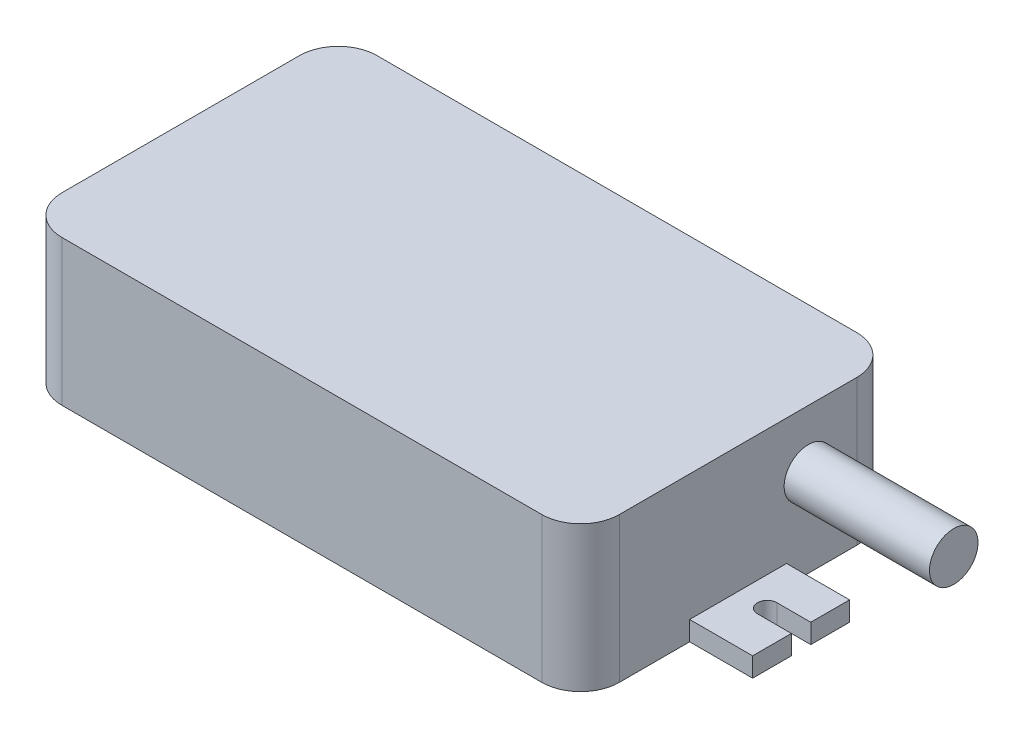
ISO-10303-21;
HEADER;
FILE_DESCRIPTION(('STEP AP214'),'2;1');
FILE_NAME('part.step','',(''),(''),'','','');
FILE_SCHEMA(('AUTOMOTIVE_DESIGN { 1 0 10303 214 1 1 1 1 }'));
ENDSEC;
DATA;
#1=APPLICATION_CONTEXT('core data for automotive mechanical design processes');
#2=APPLICATION_PROTOCOL_DEFINITION('international standard','automotive_design',2000,#1);
#3=PRODUCT_CONTEXT('',#1,'mechanical');
#4=PRODUCT('Part','Part','',(#3));
#5=PRODUCT_RELATED_PRODUCT_CATEGORY('part','',(#4));
#6=PRODUCT_DEFINITION_FORMATION('','',#4);
#7=PRODUCT_DEFINITION_CONTEXT('part definition',#1,'design');
#8=PRODUCT_DEFINITION('design','',#6,#7);
#9=PRODUCT_DEFINITION_SHAPE('','',#8);
#10=(LENGTH_UNIT() NAMED_UNIT(*) SI_UNIT(.MILLI.,.METRE.));
#11=(NAMED_UNIT(*) PLANE_ANGLE_UNIT() SI_UNIT($,.RADIAN.));
#12=(NAMED_UNIT(*) SI_UNIT($,.STERADIAN.) SOLID_ANGLE_UNIT());
#13=UNCERTAINTY_MEASURE_WITH_UNIT(LENGTH_MEASURE(1.E-05),#10,'distance_accuracy_value','');
#14=(GEOMETRIC_REPRESENTATION_CONTEXT(3) GLOBAL_UNCERTAINTY_ASSIGNED_CONTEXT((#13)) GLOBAL_UNIT_ASSIGNED_CONTEXT((#10,
#11,#12)) REPRESENTATION_CONTEXT('',''));
#15=CARTESIAN_POINT('',(0.,0.,0.));
#16=DIRECTION('',(0.,0.,1.));
#17=DIRECTION('',(1.,0.,0.));
#18=AXIS2_PLACEMENT_3D('',#15,#16,#17);
#19=CARTESIAN_POINT('',(-57.5,30.,-32.5));
#20=DIRECTION('',(1.,0.,0.));
#21=DIRECTION('',(0.,0.,-1.));
#22=AXIS2_PLACEMENT_3D('',#19,#20,#21);
#23=PLANE('',#22);
#24=DIRECTION('',(0.,0.,1.));
#25=VECTOR('',#24,1.);
#26=CARTESIAN_POINT('',(-57.5,0.,-32.5));
#27=LINE('',#26,#25);
#28=CARTESIAN_POINT('',(-57.5,0.,10.));
#29=VERTEX_POINT('',#28);
#30=CARTESIAN_POINT('',(-57.5,0.,24.5));
#31=VERTEX_POINT('',#30);
#32=EDGE_CURVE('E328',#29,#31,#27,.T.);
#33=ORIENTED_EDGE('',*,*,#32,.T.);
#34=DIRECTION('',(0.,-1.,0.));
#35=VECTOR('',#34,1.);
#36=CARTESIAN_POINT('',(-57.5,30.,24.5));
#37=LINE('',#36,#35);
#38=CARTESIAN_POINT('',(-57.5,30.,24.5));
#39=VERTEX_POINT('',#38);
#40=EDGE_CURVE('E371',#31,#39,#37,.F.);
#41=ORIENTED_EDGE('',*,*,#40,.T.);
#42=DIRECTION('',(0.,0.,1.));
#43=VECTOR('',#42,1.);
#44=CARTESIAN_POINT('',(-57.5,30.,-32.5));
#45=LINE('',#44,#43);
#46=CARTESIAN_POINT('',(-57.5,30.,-24.5));
#47=VERTEX_POINT('',#46);
#48=EDGE_CURVE('E329',#47,#39,#45,.T.);
#49=ORIENTED_EDGE('',*,*,#48,.F.);
#50=DIRECTION('',(0.,-1.,0.));
#51=VECTOR('',#50,1.);
#52=CARTESIAN_POINT('',(-57.5,30.,-24.5));
#53=LINE('',#52,#51);
#54=CARTESIAN_POINT('',(-57.5,0.,-24.5));
#55=VERTEX_POINT('',#54);
#56=EDGE_CURVE('E368',#47,#55,#53,.T.);
#57=ORIENTED_EDGE('',*,*,#56,.T.);
#58=CARTESIAN_POINT('',(-57.5,0.,-10.));
#59=VERTEX_POINT('',#58);
#60=EDGE_CURVE('E341',#55,#59,#27,.T.);
#61=ORIENTED_EDGE('',*,*,#60,.T.);
#62=DIRECTION('',(0.,1.,0.));
#63=VECTOR('',#62,1.);
#64=CARTESIAN_POINT('',(-57.5,30.,-10.));
#65=LINE('',#64,#63);
#66=CARTESIAN_POINT('',(-57.5,4.,-10.));
#67=VERTEX_POINT('',#66);
#68=EDGE_CURVE('E323',#59,#67,#65,.T.);
#69=ORIENTED_EDGE('',*,*,#68,.T.);
#70=DIRECTION('',(0.,0.,-1.));
#71=VECTOR('',#70,1.);
#72=CARTESIAN_POINT('',(-57.5,4.,-32.5));
#73=LINE('',#72,#71);
#74=CARTESIAN_POINT('',(-57.5,4.,10.));
#75=VERTEX_POINT('',#74);
#76=EDGE_CURVE('E325',#75,#67,#73,.T.);
#77=ORIENTED_EDGE('',*,*,#76,.F.);
#78=DIRECTION('',(0.,-1.,0.));
#79=VECTOR('',#78,1.);
#80=CARTESIAN_POINT('',(-57.5,30.,10.));
#81=LINE('',#80,#79);
#82=EDGE_CURVE('E317',#75,#29,#81,.T.);
#83=ORIENTED_EDGE('',*,*,#82,.T.);
#84=EDGE_LOOP('',(#33,#41,#49,#57,#61,#69,#77,#83));
#85=FACE_BOUND('',#84,.T.);
#86=ADVANCED_FACE('F36',(#85),#23,.F.);
#87=CARTESIAN_POINT('',(-57.5,30.,32.5));
#88=DIRECTION('',(0.,0.,-1.));
#89=DIRECTION('',(-1.,0.,0.));
#90=AXIS2_PLACEMENT_3D('',#87,#88,#89);
#91=PLANE('',#90);
#92=DIRECTION('',(1.,0.,0.));
#93=VECTOR('',#92,1.);
#94=CARTESIAN_POINT('',(-57.5,30.,32.5));
#95=LINE('',#94,#93);
#96=CARTESIAN_POINT('',(-49.5,30.,32.5));
#97=VERTEX_POINT('',#96);
#98=CARTESIAN_POINT('',(49.5,30.,32.5));
#99=VERTEX_POINT('',#98);
#100=EDGE_CURVE('E332',#97,#99,#95,.T.);
#101=ORIENTED_EDGE('',*,*,#100,.F.);
#102=DIRECTION('',(0.,-1.,0.));
#103=VECTOR('',#102,1.);
#104=CARTESIAN_POINT('',(-49.5,30.,32.5));
#105=LINE('',#104,#103);
#106=CARTESIAN_POINT('',(-49.5,0.,32.5));
#107=VERTEX_POINT('',#106);
#108=EDGE_CURVE('E357',#97,#107,#105,.T.);
#109=ORIENTED_EDGE('',*,*,#108,.T.);
#110=DIRECTION('',(1.,0.,0.));
#111=VECTOR('',#110,1.);
#112=CARTESIAN_POINT('',(-57.5,0.,32.5));
#113=LINE('',#112,#111);
#114=CARTESIAN_POINT('',(49.5,0.,32.5));
#115=VERTEX_POINT('',#114);
#116=EDGE_CURVE('E343',#107,#115,#113,.T.);
#117=ORIENTED_EDGE('',*,*,#116,.T.);
#118=DIRECTION('',(0.,-1.,0.));
#119=VECTOR('',#118,1.);
#120=CARTESIAN_POINT('',(49.5,30.,32.5));
#121=LINE('',#120,#119);
#122=EDGE_CURVE('E355',#115,#99,#121,.F.);
#123=ORIENTED_EDGE('',*,*,#122,.T.);
#124=EDGE_LOOP('',(#101,#109,#117,#123));
#125=FACE_BOUND('',#124,.T.);
#126=ADVANCED_FACE('F414',(#125),#91,.F.);
#127=CARTESIAN_POINT('',(57.5,30.,-32.5));
#128=DIRECTION('',(-1.,0.,0.));
#129=DIRECTION('',(0.,0.,1.));
#130=AXIS2_PLACEMENT_3D('',#127,#128,#129);
#131=PLANE('',#130);
#132=CARTESIAN_POINT('',(57.5,18.,-14.5));
#133=DIRECTION('',(-1.,0.,0.));
#134=DIRECTION('',(0.,0.,1.));
#135=AXIS2_PLACEMENT_3D('',#132,#133,#134);
#136=CIRCLE('',#135,5.);
#137=CARTESIAN_POINT('',(57.5,18.,-9.50000000000001));
#138=VERTEX_POINT('',#137);
#139=EDGE_CURVE('E352',#138,#138,#136,.F.);
#140=ORIENTED_EDGE('',*,*,#139,.F.);
#141=EDGE_LOOP('',(#140));
#142=FACE_BOUND('',#141,.T.);
#143=DIRECTION('',(0.,0.,-1.));
#144=VECTOR('',#143,1.);
#145=CARTESIAN_POINT('',(57.5,30.,-32.5));
#146=LINE('',#145,#144);
#147=CARTESIAN_POINT('',(57.5,30.,24.5));
#148=VERTEX_POINT('',#147);
#149=CARTESIAN_POINT('',(57.5,30.,-24.5));
#150=VERTEX_POINT('',#149);
#151=EDGE_CURVE('E336',#148,#150,#146,.T.);
#152=ORIENTED_EDGE('',*,*,#151,.F.);
#153=DIRECTION('',(0.,-1.,0.));
#154=VECTOR('',#153,1.);
#155=CARTESIAN_POINT('',(57.5,30.,24.5));
#156=LINE('',#155,#154);
#157=CARTESIAN_POINT('',(57.5,0.,24.5));
#158=VERTEX_POINT('',#157);
#159=EDGE_CURVE('E11',#148,#158,#156,.T.);
#160=ORIENTED_EDGE('',*,*,#159,.T.);
#161=DIRECTION('',(0.,0.,-1.));
#162=VECTOR('',#161,1.);
#163=CARTESIAN_POINT('',(57.5,0.,-32.5));
#164=LINE('',#163,#162);
#165=CARTESIAN_POINT('',(57.5,0.,10.));
#166=VERTEX_POINT('',#165);
#167=EDGE_CURVE('E347',#158,#166,#164,.T.);
#168=ORIENTED_EDGE('',*,*,#167,.T.);
#169=DIRECTION('',(0.,1.,0.));
#170=VECTOR('',#169,1.);
#171=CARTESIAN_POINT('',(57.5,30.,10.));
#172=LINE('',#171,#170);
#173=CARTESIAN_POINT('',(57.5,4.,10.));
#174=VERTEX_POINT('',#173);
#175=EDGE_CURVE('E295',#166,#174,#172,.T.);
#176=ORIENTED_EDGE('',*,*,#175,.T.);
#177=DIRECTION('',(0.,0.,1.));
#178=VECTOR('',#177,1.);
#179=CARTESIAN_POINT('',(57.5,4.,-32.5));
#180=LINE('',#179,#178);
#181=CARTESIAN_POINT('',(57.5,4.,-10.));
#182=VERTEX_POINT('',#181);
#183=EDGE_CURVE('E340',#182,#174,#180,.T.);
#184=ORIENTED_EDGE('',*,*,#183,.F.);
#185=DIRECTION('',(0.,-1.,0.));
#186=VECTOR('',#185,1.);
#187=CARTESIAN_POINT('',(57.5,30.,-10.));
#188=LINE('',#187,#186);
#189=CARTESIAN_POINT('',(57.5,0.,-10.));
#190=VERTEX_POINT('',#189);
#191=EDGE_CURVE('E320',#182,#190,#188,.T.);
#192=ORIENTED_EDGE('',*,*,#191,.T.);
#193=CARTESIAN_POINT('',(57.5,0.,-24.5));
#194=VERTEX_POINT('',#193);
#195=EDGE_CURVE('E346',#190,#194,#164,.T.);
#196=ORIENTED_EDGE('',*,*,#195,.T.);
#197=DIRECTION('',(0.,-1.,0.));
#198=VECTOR('',#197,1.);
#199=CARTESIAN_POINT('',(57.5,30.,-24.5));
#200=LINE('',#199,#198);
#201=EDGE_CURVE('E44',#194,#150,#200,.F.);
#202=ORIENTED_EDGE('',*,*,#201,.T.);
#203=EDGE_LOOP('',(#152,#160,#168,#176,#184,#192,#196,#202));
#204=FACE_BOUND('',#203,.T.);
#205=ADVANCED_FACE('F387',(#142,#204),#131,.F.);
#206=CARTESIAN_POINT('',(-57.5,30.,-32.5));
#207=DIRECTION('',(0.,0.,1.));
#208=DIRECTION('',(1.,0.,0.));
#209=AXIS2_PLACEMENT_3D('',#206,#207,#208);
#210=PLANE('',#209);
#211=DIRECTION('',(-1.,0.,0.));
#212=VECTOR('',#211,1.);
#213=CARTESIAN_POINT('',(-57.5,0.,-32.5));
#214=LINE('',#213,#212);
#215=CARTESIAN_POINT('',(49.5,0.,-32.5));
#216=VERTEX_POINT('',#215);
#217=CARTESIAN_POINT('',(-49.5,0.,-32.5));
#218=VERTEX_POINT('',#217);
#219=EDGE_CURVE('E333',#216,#218,#214,.T.);
#220=ORIENTED_EDGE('',*,*,#219,.T.);
#221=DIRECTION('',(0.,-1.,0.));
#222=VECTOR('',#221,1.);
#223=CARTESIAN_POINT('',(-49.5,30.,-32.5));
#224=LINE('',#223,#222);
#225=CARTESIAN_POINT('',(-49.5,30.,-32.5));
#226=VERTEX_POINT('',#225);
#227=EDGE_CURVE('E51',#218,#226,#224,.F.);
#228=ORIENTED_EDGE('',*,*,#227,.T.);
#229=DIRECTION('',(-1.,0.,0.));
#230=VECTOR('',#229,1.);
#231=CARTESIAN_POINT('',(-57.5,30.,-32.5));
#232=LINE('',#231,#230);
#233=CARTESIAN_POINT('',(49.5,30.,-32.5));
#234=VERTEX_POINT('',#233);
#235=EDGE_CURVE('E338',#234,#226,#232,.T.);
#236=ORIENTED_EDGE('',*,*,#235,.F.);
#237=DIRECTION('',(0.,-1.,0.));
#238=VECTOR('',#237,1.);
#239=CARTESIAN_POINT('',(49.5,30.,-32.5));
#240=LINE('',#239,#238);
#241=EDGE_CURVE('E380',#234,#216,#240,.T.);
#242=ORIENTED_EDGE('',*,*,#241,.T.);
#243=EDGE_LOOP('',(#220,#228,#236,#242));
#244=FACE_BOUND('',#243,.T.);
#245=ADVANCED_FACE('F394',(#244),#210,.F.);
#246=CARTESIAN_POINT('',(0.,30.,0.));
#247=DIRECTION('',(0.,1.,0.));
#248=DIRECTION('',(0.,0.,1.));
#249=AXIS2_PLACEMENT_3D('',#246,#247,#248);
#250=PLANE('',#249);
#251=ORIENTED_EDGE('',*,*,#48,.T.);
#252=CARTESIAN_POINT('',(-49.5,30.,24.5));
#253=DIRECTION('',(0.,1.,0.));
#254=DIRECTION('',(0.,0.,1.));
#255=AXIS2_PLACEMENT_3D('',#252,#253,#254);
#256=CIRCLE('',#255,8.);
#257=EDGE_CURVE('E378',#39,#97,#256,.T.);
#258=ORIENTED_EDGE('',*,*,#257,.T.);
#259=ORIENTED_EDGE('',*,*,#100,.T.);
#260=CARTESIAN_POINT('',(49.5,30.,24.5));
#261=DIRECTION('',(0.,1.,0.));
#262=DIRECTION('',(0.,0.,1.));
#263=AXIS2_PLACEMENT_3D('',#260,#261,#262);
#264=CIRCLE('',#263,8.);
#265=EDGE_CURVE('E374',#99,#148,#264,.T.);
#266=ORIENTED_EDGE('',*,*,#265,.T.);
#267=ORIENTED_EDGE('',*,*,#151,.T.);
#268=CARTESIAN_POINT('',(49.5,30.,-24.5));
#269=DIRECTION('',(0.,1.,0.));
#270=DIRECTION('',(0.,0.,1.));
#271=AXIS2_PLACEMENT_3D('',#268,#269,#270);
#272=CIRCLE('',#271,8.);
#273=EDGE_CURVE('E58',#150,#234,#272,.T.);
#274=ORIENTED_EDGE('',*,*,#273,.T.);
#275=ORIENTED_EDGE('',*,*,#235,.T.);
#276=CARTESIAN_POINT('',(-49.5,30.,-24.5));
#277=DIRECTION('',(0.,1.,0.));
#278=DIRECTION('',(0.,0.,1.));
#279=AXIS2_PLACEMENT_3D('',#276,#277,#278);
#280=CIRCLE('',#279,8.);
#281=EDGE_CURVE('E376',#226,#47,#280,.T.);
#282=ORIENTED_EDGE('',*,*,#281,.T.);
#283=EDGE_LOOP('',(#251,#258,#259,#266,#267,#274,#275,#282));
#284=FACE_BOUND('',#283,.T.);
#285=ADVANCED_FACE('F390',(#284),#250,.T.);
#286=CARTESIAN_POINT('',(0.,0.,0.));
#287=DIRECTION('',(0.,1.,0.));
#288=DIRECTION('',(0.,0.,1.));
#289=AXIS2_PLACEMENT_3D('',#286,#287,#288);
#290=PLANE('',#289);
#291=ORIENTED_EDGE('',*,*,#116,.F.);
#292=CARTESIAN_POINT('',(-49.5,0.,24.5));
#293=DIRECTION('',(0.,1.,0.));
#294=DIRECTION('',(0.,0.,1.));
#295=AXIS2_PLACEMENT_3D('',#292,#293,#294);
#296=CIRCLE('',#295,8.);
#297=EDGE_CURVE('E366',#107,#31,#296,.F.);
#298=ORIENTED_EDGE('',*,*,#297,.T.);
#299=ORIENTED_EDGE('',*,*,#32,.F.);
#300=DIRECTION('',(-1.,0.,0.));
#301=VECTOR('',#300,1.);
#302=CARTESIAN_POINT('',(-70.5,0.,10.));
#303=LINE('',#302,#301);
#304=CARTESIAN_POINT('',(-70.5,0.,10.));
#305=VERTEX_POINT('',#304);
#306=EDGE_CURVE('E275',#29,#305,#303,.T.);
#307=ORIENTED_EDGE('',*,*,#306,.T.);
#308=DIRECTION('',(0.,0.,-1.));
#309=VECTOR('',#308,1.);
#310=CARTESIAN_POINT('',(-70.5,0.,10.));
#311=LINE('',#310,#309);
#312=CARTESIAN_POINT('',(-70.5,0.,2.));
#313=VERTEX_POINT('',#312);
#314=EDGE_CURVE('E279',#305,#313,#311,.T.);
#315=ORIENTED_EDGE('',*,*,#314,.T.);
#316=DIRECTION('',(1.,0.,0.));
#317=VECTOR('',#316,1.);
#318=CARTESIAN_POINT('',(-63.5,0.,2.));
#319=LINE('',#318,#317);
#320=CARTESIAN_POINT('',(-63.5,0.,2.));
#321=VERTEX_POINT('',#320);
#322=EDGE_CURVE('E282',#313,#321,#319,.T.);
#323=ORIENTED_EDGE('',*,*,#322,.T.);
#324=CARTESIAN_POINT('',(-63.5,0.,0.));
#325=DIRECTION('',(0.,1.,0.));
#326=DIRECTION('',(0.,0.,-1.));
#327=AXIS2_PLACEMENT_3D('',#324,#325,#326);
#328=CIRCLE('',#327,2.);
#329=CARTESIAN_POINT('',(-63.5,0.,-2.));
#330=VERTEX_POINT('',#329);
#331=EDGE_CURVE('E285',#321,#330,#328,.T.);
#332=ORIENTED_EDGE('',*,*,#331,.T.);
#333=DIRECTION('',(-1.,0.,0.));
#334=VECTOR('',#333,1.);
#335=CARTESIAN_POINT('',(-63.5,0.,-2.));
#336=LINE('',#335,#334);
#337=CARTESIAN_POINT('',(-70.5,0.,-2.));
#338=VERTEX_POINT('',#337);
#339=EDGE_CURVE('E288',#330,#338,#336,.T.);
#340=ORIENTED_EDGE('',*,*,#339,.T.);
#341=DIRECTION('',(0.,0.,-1.));
#342=VECTOR('',#341,1.);
#343=CARTESIAN_POINT('',(-70.5,0.,-2.));
#344=LINE('',#343,#342);
#345=CARTESIAN_POINT('',(-70.5,0.,-10.));
#346=VERTEX_POINT('',#345);
#347=EDGE_CURVE('E291',#338,#346,#344,.T.);
#348=ORIENTED_EDGE('',*,*,#347,.T.);
#349=DIRECTION('',(1.,0.,0.));
#350=VECTOR('',#349,1.);
#351=CARTESIAN_POINT('',(-70.5,0.,-10.));
#352=LINE('',#351,#350);
#353=EDGE_CURVE('E226',#346,#59,#352,.T.);
#354=ORIENTED_EDGE('',*,*,#353,.T.);
#355=ORIENTED_EDGE('',*,*,#60,.F.);
#356=CARTESIAN_POINT('',(-49.5,0.,-24.5));
#357=DIRECTION('',(0.,1.,0.));
#358=DIRECTION('',(0.,0.,1.));
#359=AXIS2_PLACEMENT_3D('',#356,#357,#358);
#360=CIRCLE('',#359,8.);
#361=EDGE_CURVE('E364',#55,#218,#360,.F.);
#362=ORIENTED_EDGE('',*,*,#361,.T.);
#363=ORIENTED_EDGE('',*,*,#219,.F.);
#364=CARTESIAN_POINT('',(49.5,0.,-24.5));
#365=DIRECTION('',(0.,1.,0.));
#366=DIRECTION('',(0.,0.,1.));
#367=AXIS2_PLACEMENT_3D('',#364,#365,#366);
#368=CIRCLE('',#367,8.);
#369=EDGE_CURVE('E360',#216,#194,#368,.F.);
#370=ORIENTED_EDGE('',*,*,#369,.T.);
#371=ORIENTED_EDGE('',*,*,#195,.F.);
#372=CARTESIAN_POINT('',(70.5,0.,-10.));
#373=VERTEX_POINT('',#372);
#374=EDGE_CURVE('E229',#190,#373,#352,.T.);
#375=ORIENTED_EDGE('',*,*,#374,.T.);
#376=DIRECTION('',(0.,0.,1.));
#377=VECTOR('',#376,1.);
#378=CARTESIAN_POINT('',(70.5,0.,-2.));
#379=LINE('',#378,#377);
#380=CARTESIAN_POINT('',(70.5,0.,-2.));
#381=VERTEX_POINT('',#380);
#382=EDGE_CURVE('E263',#373,#381,#379,.T.);
#383=ORIENTED_EDGE('',*,*,#382,.T.);
#384=DIRECTION('',(-1.,0.,0.));
#385=VECTOR('',#384,1.);
#386=CARTESIAN_POINT('',(63.5,0.,-2.));
#387=LINE('',#386,#385);
#388=CARTESIAN_POINT('',(63.5,0.,-2.));
#389=VERTEX_POINT('',#388);
#390=EDGE_CURVE('E204',#381,#389,#387,.T.);
#391=ORIENTED_EDGE('',*,*,#390,.T.);
#392=CARTESIAN_POINT('',(63.5,0.,0.));
#393=DIRECTION('',(0.,1.,0.));
#394=DIRECTION('',(0.,0.,-1.));
#395=AXIS2_PLACEMENT_3D('',#392,#393,#394);
#396=CIRCLE('',#395,2.);
#397=CARTESIAN_POINT('',(63.5,0.,2.));
#398=VERTEX_POINT('',#397);
#399=EDGE_CURVE('E266',#389,#398,#396,.T.);
#400=ORIENTED_EDGE('',*,*,#399,.T.);
#401=DIRECTION('',(1.,0.,0.));
#402=VECTOR('',#401,1.);
#403=CARTESIAN_POINT('',(63.5,0.,2.));
#404=LINE('',#403,#402);
#405=CARTESIAN_POINT('',(70.5,0.,2.));
#406=VERTEX_POINT('',#405);
#407=EDGE_CURVE('E269',#398,#406,#404,.T.);
#408=ORIENTED_EDGE('',*,*,#407,.T.);
#409=DIRECTION('',(0.,0.,1.));
#410=VECTOR('',#409,1.);
#411=CARTESIAN_POINT('',(70.5,0.,10.));
#412=LINE('',#411,#410);
#413=CARTESIAN_POINT('',(70.5,0.,10.));
#414=VERTEX_POINT('',#413);
#415=EDGE_CURVE('E272',#406,#414,#412,.T.);
#416=ORIENTED_EDGE('',*,*,#415,.T.);
#417=EDGE_CURVE('E276',#414,#166,#303,.T.);
#418=ORIENTED_EDGE('',*,*,#417,.T.);
#419=ORIENTED_EDGE('',*,*,#167,.F.);
#420=CARTESIAN_POINT('',(49.5,0.,24.5));
#421=DIRECTION('',(0.,1.,0.));
#422=DIRECTION('',(0.,0.,1.));
#423=AXIS2_PLACEMENT_3D('',#420,#421,#422);
#424=CIRCLE('',#423,8.);
#425=EDGE_CURVE('E362',#158,#115,#424,.F.);
#426=ORIENTED_EDGE('',*,*,#425,.T.);
#427=EDGE_LOOP('',(#291,#298,#299,#307,#315,#323,#332,#340,#348,#354,#355,#362,#363,#370,#371,
#375,#383,#391,#400,#408,#416,#418,#419,#426));
#428=FACE_BOUND('',#427,.T.);
#429=ADVANCED_FACE('F397',(#428),#290,.F.);
#430=CARTESIAN_POINT('',(70.5,4.,10.));
#431=DIRECTION('',(1.,0.,0.));
#432=DIRECTION('',(0.,0.,-1.));
#433=AXIS2_PLACEMENT_3D('',#430,#431,#432);
#434=PLANE('',#433);
#435=ORIENTED_EDGE('',*,*,#415,.F.);
#436=DIRECTION('',(0.,-1.,0.));
#437=VECTOR('',#436,1.);
#438=CARTESIAN_POINT('',(70.5,4.,2.));
#439=LINE('',#438,#437);
#440=CARTESIAN_POINT('',(70.5,4.,2.));
#441=VERTEX_POINT('',#440);
#442=EDGE_CURVE('E311',#441,#406,#439,.T.);
#443=ORIENTED_EDGE('',*,*,#442,.F.);
#444=DIRECTION('',(0.,0.,1.));
#445=VECTOR('',#444,1.);
#446=CARTESIAN_POINT('',(70.5,4.,10.));
#447=LINE('',#446,#445);
#448=CARTESIAN_POINT('',(70.5,4.,10.));
#449=VERTEX_POINT('',#448);
#450=EDGE_CURVE('E238',#441,#449,#447,.T.);
#451=ORIENTED_EDGE('',*,*,#450,.T.);
#452=DIRECTION('',(0.,-1.,0.));
#453=VECTOR('',#452,1.);
#454=CARTESIAN_POINT('',(70.5,4.,10.));
#455=LINE('',#454,#453);
#456=EDGE_CURVE('E309',#449,#414,#455,.T.);
#457=ORIENTED_EDGE('',*,*,#456,.T.);
#458=EDGE_LOOP('',(#435,#443,#451,#457));
#459=FACE_BOUND('',#458,.T.);
#460=ADVANCED_FACE('F427',(#459),#434,.T.);
#461=CARTESIAN_POINT('',(63.5,4.,2.));
#462=DIRECTION('',(0.,0.,-1.));
#463=DIRECTION('',(-1.,0.,0.));
#464=AXIS2_PLACEMENT_3D('',#461,#462,#463);
#465=PLANE('',#464);
#466=ORIENTED_EDGE('',*,*,#407,.F.);
#467=DIRECTION('',(0.,-1.,0.));
#468=VECTOR('',#467,1.);
#469=CARTESIAN_POINT('',(63.5,4.,2.));
#470=LINE('',#469,#468);
#471=CARTESIAN_POINT('',(63.5,4.,2.));
#472=VERTEX_POINT('',#471);
#473=EDGE_CURVE('E313',#472,#398,#470,.T.);
#474=ORIENTED_EDGE('',*,*,#473,.F.);
#475=DIRECTION('',(1.,0.,0.));
#476=VECTOR('',#475,1.);
#477=CARTESIAN_POINT('',(63.5,4.,2.));
#478=LINE('',#477,#476);
#479=EDGE_CURVE('E235',#472,#441,#478,.T.);
#480=ORIENTED_EDGE('',*,*,#479,.T.);
#481=ORIENTED_EDGE('',*,*,#442,.T.);
#482=EDGE_LOOP('',(#466,#474,#480,#481));
#483=FACE_BOUND('',#482,.T.);
#484=ADVANCED_FACE('F437',(#483),#465,.T.);
#485=CARTESIAN_POINT('',(63.5,4.,0.));
#486=DIRECTION('',(0.,-1.,0.));
#487=DIRECTION('',(0.,0.,-1.));
#488=AXIS2_PLACEMENT_3D('',#485,#486,#487);
#489=CYLINDRICAL_SURFACE('',#488,2.);
#490=ORIENTED_EDGE('',*,*,#399,.F.);
#491=DIRECTION('',(0.,-1.,0.));
#492=VECTOR('',#491,1.);
#493=CARTESIAN_POINT('',(63.5,4.,-2.));
#494=LINE('',#493,#492);
#495=CARTESIAN_POINT('',(63.5,4.,-2.));
#496=VERTEX_POINT('',#495);
#497=EDGE_CURVE('E209',#496,#389,#494,.T.);
#498=ORIENTED_EDGE('',*,*,#497,.F.);
#499=CARTESIAN_POINT('',(63.5,4.,0.));
#500=DIRECTION('',(0.,1.,0.));
#501=DIRECTION('',(0.,0.,-1.));
#502=AXIS2_PLACEMENT_3D('',#499,#500,#501);
#503=CIRCLE('',#502,2.);
#504=EDGE_CURVE('E220',#496,#472,#503,.T.);
#505=ORIENTED_EDGE('',*,*,#504,.T.);
#506=ORIENTED_EDGE('',*,*,#473,.T.);
#507=EDGE_LOOP('',(#490,#498,#505,#506));
#508=FACE_BOUND('',#507,.T.);
#509=ADVANCED_FACE('F435',(#508),#489,.F.);
#510=CARTESIAN_POINT('',(63.5,4.,-2.));
#511=DIRECTION('',(0.,0.,1.));
#512=DIRECTION('',(1.,0.,0.));
#513=AXIS2_PLACEMENT_3D('',#510,#511,#512);
#514=PLANE('',#513);
#515=ORIENTED_EDGE('',*,*,#390,.F.);
#516=DIRECTION('',(0.,-1.,0.));
#517=VECTOR('',#516,1.);
#518=CARTESIAN_POINT('',(70.5,4.,-2.));
#519=LINE('',#518,#517);
#520=CARTESIAN_POINT('',(70.5,4.,-2.));
#521=VERTEX_POINT('',#520);
#522=EDGE_CURVE('E199',#521,#381,#519,.T.);
#523=ORIENTED_EDGE('',*,*,#522,.F.);
#524=DIRECTION('',(-1.,0.,0.));
#525=VECTOR('',#524,1.);
#526=CARTESIAN_POINT('',(63.5,4.,-2.));
#527=LINE('',#526,#525);
#528=EDGE_CURVE('E202',#521,#496,#527,.T.);
#529=ORIENTED_EDGE('',*,*,#528,.T.);
#530=ORIENTED_EDGE('',*,*,#497,.T.);
#531=EDGE_LOOP('',(#515,#523,#529,#530));
#532=FACE_BOUND('',#531,.T.);
#533=ADVANCED_FACE('F201',(#532),#514,.T.);
#534=CARTESIAN_POINT('',(70.5,4.,-2.));
#535=DIRECTION('',(1.,0.,0.));
#536=DIRECTION('',(0.,0.,-1.));
#537=AXIS2_PLACEMENT_3D('',#534,#535,#536);
#538=PLANE('',#537);
#539=ORIENTED_EDGE('',*,*,#382,.F.);
#540=DIRECTION('',(0.,-1.,0.));
#541=VECTOR('',#540,1.);
#542=CARTESIAN_POINT('',(70.5,4.,-10.));
#543=LINE('',#542,#541);
#544=CARTESIAN_POINT('',(70.5,4.,-10.));
#545=VERTEX_POINT('',#544);
#546=EDGE_CURVE('E225',#545,#373,#543,.T.);
#547=ORIENTED_EDGE('',*,*,#546,.F.);
#548=DIRECTION('',(0.,0.,1.));
#549=VECTOR('',#548,1.);
#550=CARTESIAN_POINT('',(70.5,4.,-2.));
#551=LINE('',#550,#549);
#552=EDGE_CURVE('E217',#545,#521,#551,.T.);
#553=ORIENTED_EDGE('',*,*,#552,.T.);
#554=ORIENTED_EDGE('',*,*,#522,.T.);
#555=EDGE_LOOP('',(#539,#547,#553,#554));
#556=FACE_BOUND('',#555,.T.);
#557=ADVANCED_FACE('F223',(#556),#538,.T.);
#558=CARTESIAN_POINT('',(-63.5,4.,0.));
#559=DIRECTION('',(0.,-1.,0.));
#560=DIRECTION('',(0.,0.,-1.));
#561=AXIS2_PLACEMENT_3D('',#558,#559,#560);
#562=PLANE('',#561);
#563=DIRECTION('',(1.,0.,0.));
#564=VECTOR('',#563,1.);
#565=CARTESIAN_POINT('',(-70.5,4.,-10.));
#566=LINE('',#565,#564);
#567=EDGE_CURVE('E260',#182,#545,#566,.T.);
#568=ORIENTED_EDGE('',*,*,#567,.F.);
#569=ORIENTED_EDGE('',*,*,#183,.T.);
#570=DIRECTION('',(-1.,0.,0.));
#571=VECTOR('',#570,1.);
#572=CARTESIAN_POINT('',(-70.5,4.,10.));
#573=LINE('',#572,#571);
#574=EDGE_CURVE('E242',#449,#174,#573,.T.);
#575=ORIENTED_EDGE('',*,*,#574,.F.);
#576=ORIENTED_EDGE('',*,*,#450,.F.);
#577=ORIENTED_EDGE('',*,*,#479,.F.);
#578=ORIENTED_EDGE('',*,*,#504,.F.);
#579=ORIENTED_EDGE('',*,*,#528,.F.);
#580=ORIENTED_EDGE('',*,*,#552,.F.);
#581=EDGE_LOOP('',(#568,#569,#575,#576,#577,#578,#579,#580));
#582=FACE_BOUND('',#581,.T.);
#583=ADVANCED_FACE('F216',(#582),#562,.F.);
#584=CARTESIAN_POINT('',(-70.5,4.,10.));
#585=DIRECTION('',(0.,0.,1.));
#586=DIRECTION('',(1.,0.,0.));
#587=AXIS2_PLACEMENT_3D('',#584,#585,#586);
#588=PLANE('',#587);
#589=ORIENTED_EDGE('',*,*,#175,.F.);
#590=ORIENTED_EDGE('',*,*,#417,.F.);
#591=ORIENTED_EDGE('',*,*,#456,.F.);
#592=ORIENTED_EDGE('',*,*,#574,.T.);
#593=EDGE_LOOP('',(#589,#590,#591,#592));
#594=FACE_BOUND('',#593,.T.);
#595=ADVANCED_FACE('F422',(#594),#588,.T.);
#596=CARTESIAN_POINT('',(-70.5,4.,-10.));
#597=DIRECTION('',(0.,0.,-1.));
#598=DIRECTION('',(-1.,0.,0.));
#599=AXIS2_PLACEMENT_3D('',#596,#597,#598);
#600=PLANE('',#599);
#601=ORIENTED_EDGE('',*,*,#191,.F.);
#602=ORIENTED_EDGE('',*,*,#567,.T.);
#603=ORIENTED_EDGE('',*,*,#546,.T.);
#604=ORIENTED_EDGE('',*,*,#374,.F.);
#605=EDGE_LOOP('',(#601,#602,#603,#604));
#606=FACE_BOUND('',#605,.T.);
#607=ADVANCED_FACE('F432',(#606),#600,.T.);
#608=CARTESIAN_POINT('',(-70.5,4.,10.));
#609=VERTEX_POINT('',#608);
#610=EDGE_CURVE('E241',#75,#609,#573,.T.);
#611=ORIENTED_EDGE('',*,*,#610,.F.);
#612=ORIENTED_EDGE('',*,*,#76,.T.);
#613=CARTESIAN_POINT('',(-70.5,4.,-10.));
#614=VERTEX_POINT('',#613);
#615=EDGE_CURVE('E210',#614,#67,#566,.T.);
#616=ORIENTED_EDGE('',*,*,#615,.F.);
#617=DIRECTION('',(0.,0.,-1.));
#618=VECTOR('',#617,1.);
#619=CARTESIAN_POINT('',(-70.5,4.,-2.));
#620=LINE('',#619,#618);
#621=CARTESIAN_POINT('',(-70.5,4.,-2.));
#622=VERTEX_POINT('',#621);
#623=EDGE_CURVE('E257',#622,#614,#620,.T.);
#624=ORIENTED_EDGE('',*,*,#623,.F.);
#625=DIRECTION('',(-1.,0.,0.));
#626=VECTOR('',#625,1.);
#627=CARTESIAN_POINT('',(-63.5,4.,-2.));
#628=LINE('',#627,#626);
#629=CARTESIAN_POINT('',(-63.5,4.,-2.));
#630=VERTEX_POINT('',#629);
#631=EDGE_CURVE('E254',#630,#622,#628,.T.);
#632=ORIENTED_EDGE('',*,*,#631,.F.);
#633=CARTESIAN_POINT('',(-63.5,4.,0.));
#634=DIRECTION('',(0.,1.,0.));
#635=DIRECTION('',(0.,0.,-1.));
#636=AXIS2_PLACEMENT_3D('',#633,#634,#635);
#637=CIRCLE('',#636,2.);
#638=CARTESIAN_POINT('',(-63.5,4.,2.));
#639=VERTEX_POINT('',#638);
#640=EDGE_CURVE('E251',#639,#630,#637,.T.);
#641=ORIENTED_EDGE('',*,*,#640,.F.);
#642=DIRECTION('',(1.,0.,0.));
#643=VECTOR('',#642,1.);
#644=CARTESIAN_POINT('',(-63.5,4.,2.));
#645=LINE('',#644,#643);
#646=CARTESIAN_POINT('',(-70.5,4.,2.));
#647=VERTEX_POINT('',#646);
#648=EDGE_CURVE('E248',#647,#639,#645,.T.);
#649=ORIENTED_EDGE('',*,*,#648,.F.);
#650=DIRECTION('',(0.,0.,-1.));
#651=VECTOR('',#650,1.);
#652=CARTESIAN_POINT('',(-70.5,4.,10.));
#653=LINE('',#652,#651);
#654=EDGE_CURVE('E245',#609,#647,#653,.T.);
#655=ORIENTED_EDGE('',*,*,#654,.F.);
#656=EDGE_LOOP('',(#611,#612,#616,#624,#632,#641,#649,#655));
#657=FACE_BOUND('',#656,.T.);
#658=ADVANCED_FACE('F613',(#657),#562,.F.);
#659=ORIENTED_EDGE('',*,*,#68,.F.);
#660=ORIENTED_EDGE('',*,*,#353,.F.);
#661=DIRECTION('',(0.,-1.,0.));
#662=VECTOR('',#661,1.);
#663=CARTESIAN_POINT('',(-70.5,4.,-10.));
#664=LINE('',#663,#662);
#665=EDGE_CURVE('E296',#614,#346,#664,.T.);
#666=ORIENTED_EDGE('',*,*,#665,.F.);
#667=ORIENTED_EDGE('',*,*,#615,.T.);
#668=EDGE_LOOP('',(#659,#660,#666,#667));
#669=FACE_BOUND('',#668,.T.);
#670=ADVANCED_FACE('F603',(#669),#600,.T.);
#671=ORIENTED_EDGE('',*,*,#82,.F.);
#672=ORIENTED_EDGE('',*,*,#610,.T.);
#673=DIRECTION('',(0.,-1.,0.));
#674=VECTOR('',#673,1.);
#675=CARTESIAN_POINT('',(-70.5,4.,10.));
#676=LINE('',#675,#674);
#677=EDGE_CURVE('E306',#609,#305,#676,.T.);
#678=ORIENTED_EDGE('',*,*,#677,.T.);
#679=ORIENTED_EDGE('',*,*,#306,.F.);
#680=EDGE_LOOP('',(#671,#672,#678,#679));
#681=FACE_BOUND('',#680,.T.);
#682=ADVANCED_FACE('F593',(#681),#588,.T.);
#683=CARTESIAN_POINT('',(-70.5,4.,-2.));
#684=DIRECTION('',(-1.,0.,0.));
#685=DIRECTION('',(0.,0.,1.));
#686=AXIS2_PLACEMENT_3D('',#683,#684,#685);
#687=PLANE('',#686);
#688=ORIENTED_EDGE('',*,*,#347,.F.);
#689=DIRECTION('',(0.,-1.,0.));
#690=VECTOR('',#689,1.);
#691=CARTESIAN_POINT('',(-70.5,4.,-2.));
#692=LINE('',#691,#690);
#693=EDGE_CURVE('E298',#622,#338,#692,.T.);
#694=ORIENTED_EDGE('',*,*,#693,.F.);
#695=ORIENTED_EDGE('',*,*,#623,.T.);
#696=ORIENTED_EDGE('',*,*,#665,.T.);
#697=EDGE_LOOP('',(#688,#694,#695,#696));
#698=FACE_BOUND('',#697,.T.);
#699=ADVANCED_FACE('F583',(#698),#687,.T.);
#700=CARTESIAN_POINT('',(-63.5,4.,-2.));
#701=DIRECTION('',(0.,0.,1.));
#702=DIRECTION('',(1.,0.,0.));
#703=AXIS2_PLACEMENT_3D('',#700,#701,#702);
#704=PLANE('',#703);
#705=ORIENTED_EDGE('',*,*,#339,.F.);
#706=DIRECTION('',(0.,-1.,0.));
#707=VECTOR('',#706,1.);
#708=CARTESIAN_POINT('',(-63.5,4.,-2.));
#709=LINE('',#708,#707);
#710=EDGE_CURVE('E300',#630,#330,#709,.T.);
#711=ORIENTED_EDGE('',*,*,#710,.F.);
#712=ORIENTED_EDGE('',*,*,#631,.T.);
#713=ORIENTED_EDGE('',*,*,#693,.T.);
#714=EDGE_LOOP('',(#705,#711,#712,#713));
#715=FACE_BOUND('',#714,.T.);
#716=ADVANCED_FACE('F573',(#715),#704,.T.);
#717=CARTESIAN_POINT('',(-63.5,4.,0.));
#718=DIRECTION('',(0.,-1.,0.));
#719=DIRECTION('',(0.,0.,-1.));
#720=AXIS2_PLACEMENT_3D('',#717,#718,#719);
#721=CYLINDRICAL_SURFACE('',#720,2.);
#722=ORIENTED_EDGE('',*,*,#331,.F.);
#723=DIRECTION('',(0.,-1.,0.));
#724=VECTOR('',#723,1.);
#725=CARTESIAN_POINT('',(-63.5,4.,2.));
#726=LINE('',#725,#724);
#727=EDGE_CURVE('E302',#639,#321,#726,.T.);
#728=ORIENTED_EDGE('',*,*,#727,.F.);
#729=ORIENTED_EDGE('',*,*,#640,.T.);
#730=ORIENTED_EDGE('',*,*,#710,.T.);
#731=EDGE_LOOP('',(#722,#728,#729,#730));
#732=FACE_BOUND('',#731,.T.);
#733=ADVANCED_FACE('F563',(#732),#721,.F.);
#734=CARTESIAN_POINT('',(-63.5,4.,2.));
#735=DIRECTION('',(0.,0.,-1.));
#736=DIRECTION('',(-1.,0.,0.));
#737=AXIS2_PLACEMENT_3D('',#734,#735,#736);
#738=PLANE('',#737);
#739=ORIENTED_EDGE('',*,*,#322,.F.);
#740=DIRECTION('',(0.,-1.,0.));
#741=VECTOR('',#740,1.);
#742=CARTESIAN_POINT('',(-70.5,4.,2.));
#743=LINE('',#742,#741);
#744=EDGE_CURVE('E304',#647,#313,#743,.T.);
#745=ORIENTED_EDGE('',*,*,#744,.F.);
#746=ORIENTED_EDGE('',*,*,#648,.T.);
#747=ORIENTED_EDGE('',*,*,#727,.T.);
#748=EDGE_LOOP('',(#739,#745,#746,#747));
#749=FACE_BOUND('',#748,.T.);
#750=ADVANCED_FACE('F553',(#749),#738,.T.);
#751=CARTESIAN_POINT('',(-70.5,4.,10.));
#752=DIRECTION('',(-1.,0.,0.));
#753=DIRECTION('',(0.,0.,1.));
#754=AXIS2_PLACEMENT_3D('',#751,#752,#753);
#755=PLANE('',#754);
#756=ORIENTED_EDGE('',*,*,#314,.F.);
#757=ORIENTED_EDGE('',*,*,#677,.F.);
#758=ORIENTED_EDGE('',*,*,#654,.T.);
#759=ORIENTED_EDGE('',*,*,#744,.T.);
#760=EDGE_LOOP('',(#756,#757,#758,#759));
#761=FACE_BOUND('',#760,.T.);
#762=ADVANCED_FACE('F543',(#761),#755,.T.);
#763=CARTESIAN_POINT('',(87.5,18.,-14.5));
#764=DIRECTION('',(-1.,0.,0.));
#765=DIRECTION('',(0.,0.,1.));
#766=AXIS2_PLACEMENT_3D('',#763,#764,#765);
#767=CYLINDRICAL_SURFACE('',#766,5.);
#768=CARTESIAN_POINT('',(87.5,18.,-14.5));
#769=DIRECTION('',(1.,0.,0.));
#770=DIRECTION('',(0.,0.,-1.));
#771=AXIS2_PLACEMENT_3D('',#768,#769,#770);
#772=CIRCLE('',#771,5.);
#773=CARTESIAN_POINT('',(87.5,18.,-19.5));
#774=VERTEX_POINT('',#773);
#775=EDGE_CURVE('E232',#774,#774,#772,.T.);
#776=ORIENTED_EDGE('',*,*,#775,.F.);
#777=EDGE_LOOP('',(#776));
#778=FACE_BOUND('',#777,.T.);
#779=ORIENTED_EDGE('',*,*,#139,.T.);
#780=EDGE_LOOP('',(#779));
#781=FACE_BOUND('',#780,.T.);
#782=ADVANCED_FACE('F533',(#778,#781),#767,.T.);
#783=CARTESIAN_POINT('',(87.5,18.,-14.5));
#784=DIRECTION('',(1.,0.,0.));
#785=DIRECTION('',(0.,0.,-1.));
#786=AXIS2_PLACEMENT_3D('',#783,#784,#785);
#787=PLANE('',#786);
#788=ORIENTED_EDGE('',*,*,#775,.T.);
#789=EDGE_LOOP('',(#788));
#790=FACE_BOUND('',#789,.T.);
#791=ADVANCED_FACE('F456',(#790),#787,.T.);
#792=CARTESIAN_POINT('',(-49.5,30.,24.5));
#793=DIRECTION('',(0.,-1.,0.));
#794=DIRECTION('',(0.,0.,-1.));
#795=AXIS2_PLACEMENT_3D('',#792,#793,#794);
#796=CYLINDRICAL_SURFACE('',#795,8.);
#797=ORIENTED_EDGE('',*,*,#257,.F.);
#798=ORIENTED_EDGE('',*,*,#40,.F.);
#799=ORIENTED_EDGE('',*,*,#297,.F.);
#800=ORIENTED_EDGE('',*,*,#108,.F.);
#801=EDGE_LOOP('',(#797,#798,#799,#800));
#802=FACE_BOUND('',#801,.T.);
#803=ADVANCED_FACE('F412',(#802),#796,.T.);
#804=CARTESIAN_POINT('',(-49.5,30.,-24.5));
#805=DIRECTION('',(0.,-1.,0.));
#806=DIRECTION('',(0.,0.,-1.));
#807=AXIS2_PLACEMENT_3D('',#804,#805,#806);
#808=CYLINDRICAL_SURFACE('',#807,8.);
#809=ORIENTED_EDGE('',*,*,#281,.F.);
#810=ORIENTED_EDGE('',*,*,#227,.F.);
#811=ORIENTED_EDGE('',*,*,#361,.F.);
#812=ORIENTED_EDGE('',*,*,#56,.F.);
#813=EDGE_LOOP('',(#809,#810,#811,#812));
#814=FACE_BOUND('',#813,.T.);
#815=ADVANCED_FACE('F402',(#814),#808,.T.);
#816=CARTESIAN_POINT('',(49.5,30.,24.5));
#817=DIRECTION('',(0.,-1.,0.));
#818=DIRECTION('',(0.,0.,-1.));
#819=AXIS2_PLACEMENT_3D('',#816,#817,#818);
#820=CYLINDRICAL_SURFACE('',#819,8.);
#821=ORIENTED_EDGE('',*,*,#265,.F.);
#822=ORIENTED_EDGE('',*,*,#122,.F.);
#823=ORIENTED_EDGE('',*,*,#425,.F.);
#824=ORIENTED_EDGE('',*,*,#159,.F.);
#825=EDGE_LOOP('',(#821,#822,#823,#824));
#826=FACE_BOUND('',#825,.T.);
#827=ADVANCED_FACE('F418',(#826),#820,.T.);
#828=CARTESIAN_POINT('',(49.5,30.,-24.5));
#829=DIRECTION('',(0.,-1.,0.));
#830=DIRECTION('',(0.,0.,-1.));
#831=AXIS2_PLACEMENT_3D('',#828,#829,#830);
#832=CYLINDRICAL_SURFACE('',#831,8.);
#833=ORIENTED_EDGE('',*,*,#273,.F.);
#834=ORIENTED_EDGE('',*,*,#201,.F.);
#835=ORIENTED_EDGE('',*,*,#369,.F.);
#836=ORIENTED_EDGE('',*,*,#241,.F.);
#837=EDGE_LOOP('',(#833,#834,#835,#836));
#838=FACE_BOUND('',#837,.T.);
#839=ADVANCED_FACE('F38',(#838),#832,.T.);
#840=CLOSED_SHELL('',(#86,#126,#205,#245,#285,#429,#460,#484,#509,#533,#557,#583,#595,#607,#658,
#670,#682,#699,#716,#733,#750,#762,#782,#791,#803,#815,#827,#839));
#841=MANIFOLD_SOLID_BREP('B2',#840);
#842=ADVANCED_BREP_SHAPE_REPRESENTATION('',(#18,#841),#14);
#843=SHAPE_DEFINITION_REPRESENTATION(#9,#842);
ENDSEC;
END-ISO-10303-21;
